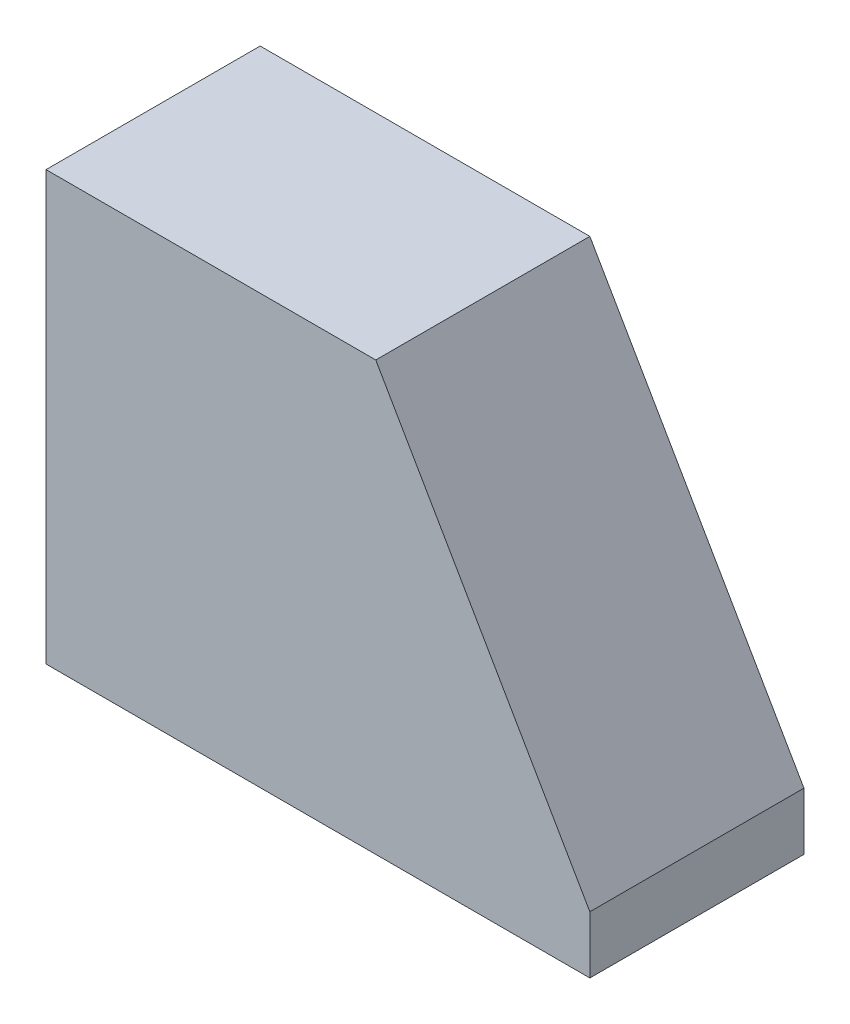
ISO-10303-21;
HEADER;
FILE_DESCRIPTION(('STEP AP214'),'2;1');
FILE_NAME('part.step','',(''),(''),'','','');
FILE_SCHEMA(('AUTOMOTIVE_DESIGN { 1 0 10303 214 1 1 1 1 }'));
ENDSEC;
DATA;
#1=APPLICATION_CONTEXT('core data for automotive mechanical design processes');
#2=APPLICATION_PROTOCOL_DEFINITION('international standard','automotive_design',2000,#1);
#3=PRODUCT_CONTEXT('',#1,'mechanical');
#4=PRODUCT('Part','Part','',(#3));
#5=PRODUCT_RELATED_PRODUCT_CATEGORY('part','',(#4));
#6=PRODUCT_DEFINITION_FORMATION('','',#4);
#7=PRODUCT_DEFINITION_CONTEXT('part definition',#1,'design');
#8=PRODUCT_DEFINITION('design','',#6,#7);
#9=PRODUCT_DEFINITION_SHAPE('','',#8);
#10=(LENGTH_UNIT() NAMED_UNIT(*) SI_UNIT(.MILLI.,.METRE.));
#11=(NAMED_UNIT(*) PLANE_ANGLE_UNIT() SI_UNIT($,.RADIAN.));
#12=(NAMED_UNIT(*) SI_UNIT($,.STERADIAN.) SOLID_ANGLE_UNIT());
#13=UNCERTAINTY_MEASURE_WITH_UNIT(LENGTH_MEASURE(1.E-05),#10,'distance_accuracy_value','');
#14=(GEOMETRIC_REPRESENTATION_CONTEXT(3) GLOBAL_UNCERTAINTY_ASSIGNED_CONTEXT((#13)) GLOBAL_UNIT_ASSIGNED_CONTEXT((#10,
#11,#12)) REPRESENTATION_CONTEXT('',''));
#15=CARTESIAN_POINT('',(0.,0.,0.));
#16=DIRECTION('',(0.,0.,1.));
#17=DIRECTION('',(1.,0.,0.));
#18=AXIS2_PLACEMENT_3D('',#15,#16,#17);
#19=CARTESIAN_POINT('',(25.4,-10.,-5.));
#20=DIRECTION('',(0.,0.,1.));
#21=DIRECTION('',(1.,0.,0.));
#22=AXIS2_PLACEMENT_3D('',#19,#20,#21);
#23=PLANE('',#22);
#24=DIRECTION('',(-1.,0.,0.));
#25=VECTOR('',#24,1.);
#26=CARTESIAN_POINT('',(25.4,10.,-5.));
#27=LINE('',#26,#25);
#28=CARTESIAN_POINT('',(15.4,10.,-5.));
#29=VERTEX_POINT('',#28);
#30=CARTESIAN_POINT('',(0.,10.,-5.));
#31=VERTEX_POINT('',#30);
#32=EDGE_CURVE('E138',#29,#31,#27,.T.);
#33=ORIENTED_EDGE('',*,*,#32,.F.);
#34=DIRECTION('',(-0.500000000000001,0.866025403784438,0.));
#35=VECTOR('',#34,1.);
#36=CARTESIAN_POINT('',(25.4,-7.32050807568877,-5.));
#37=LINE('',#36,#35);
#38=CARTESIAN_POINT('',(25.4,-7.32050807568877,-5.));
#39=VERTEX_POINT('',#38);
#40=EDGE_CURVE('E11',#29,#39,#37,.F.);
#41=ORIENTED_EDGE('',*,*,#40,.T.);
#42=DIRECTION('',(0.,1.,0.));
#43=VECTOR('',#42,1.);
#44=CARTESIAN_POINT('',(25.4,-10.,-5.));
#45=LINE('',#44,#43);
#46=CARTESIAN_POINT('',(25.4,-10.,-5.));
#47=VERTEX_POINT('',#46);
#48=EDGE_CURVE('E101',#47,#39,#45,.T.);
#49=ORIENTED_EDGE('',*,*,#48,.F.);
#50=DIRECTION('',(-1.,0.,0.));
#51=VECTOR('',#50,1.);
#52=CARTESIAN_POINT('',(25.4,-10.,-5.));
#53=LINE('',#52,#51);
#54=CARTESIAN_POINT('',(0.,-10.,-5.));
#55=VERTEX_POINT('',#54);
#56=EDGE_CURVE('E112',#47,#55,#53,.T.);
#57=ORIENTED_EDGE('',*,*,#56,.T.);
#58=DIRECTION('',(0.,1.,0.));
#59=VECTOR('',#58,1.);
#60=CARTESIAN_POINT('',(0.,-10.,-5.));
#61=LINE('',#60,#59);
#62=EDGE_CURVE('E123',#55,#31,#61,.T.);
#63=ORIENTED_EDGE('',*,*,#62,.T.);
#64=EDGE_LOOP('',(#33,#41,#49,#57,#63));
#65=FACE_BOUND('',#64,.T.);
#66=ADVANCED_FACE('F45',(#65),#23,.F.);
#67=CARTESIAN_POINT('',(25.4,10.,5.));
#68=DIRECTION('',(0.,-1.,0.));
#69=DIRECTION('',(0.,0.,-1.));
#70=AXIS2_PLACEMENT_3D('',#67,#68,#69);
#71=PLANE('',#70);
#72=DIRECTION('',(-1.,0.,0.));
#73=VECTOR('',#72,1.);
#74=CARTESIAN_POINT('',(25.4,10.,5.));
#75=LINE('',#74,#73);
#76=CARTESIAN_POINT('',(15.4,10.,5.));
#77=VERTEX_POINT('',#76);
#78=CARTESIAN_POINT('',(0.,10.,5.));
#79=VERTEX_POINT('',#78);
#80=EDGE_CURVE('E111',#77,#79,#75,.T.);
#81=ORIENTED_EDGE('',*,*,#80,.F.);
#82=DIRECTION('',(0.,0.,-1.));
#83=VECTOR('',#82,1.);
#84=CARTESIAN_POINT('',(15.4,10.,5.));
#85=LINE('',#84,#83);
#86=EDGE_CURVE('E55',#77,#29,#85,.T.);
#87=ORIENTED_EDGE('',*,*,#86,.T.);
#88=ORIENTED_EDGE('',*,*,#32,.T.);
#89=DIRECTION('',(0.,0.,1.));
#90=VECTOR('',#89,1.);
#91=CARTESIAN_POINT('',(0.,10.,5.));
#92=LINE('',#91,#90);
#93=EDGE_CURVE('E127',#31,#79,#92,.T.);
#94=ORIENTED_EDGE('',*,*,#93,.T.);
#95=EDGE_LOOP('',(#81,#87,#88,#94));
#96=FACE_BOUND('',#95,.T.);
#97=ADVANCED_FACE('F146',(#96),#71,.F.);
#98=CARTESIAN_POINT('',(25.4,-10.,5.));
#99=DIRECTION('',(0.,0.,-1.));
#100=DIRECTION('',(-1.,0.,0.));
#101=AXIS2_PLACEMENT_3D('',#98,#99,#100);
#102=PLANE('',#101);
#103=DIRECTION('',(0.,-1.,0.));
#104=VECTOR('',#103,1.);
#105=CARTESIAN_POINT('',(25.4,-10.,5.));
#106=LINE('',#105,#104);
#107=CARTESIAN_POINT('',(25.4,-7.32050807568877,5.));
#108=VERTEX_POINT('',#107);
#109=CARTESIAN_POINT('',(25.4,-10.,5.));
#110=VERTEX_POINT('',#109);
#111=EDGE_CURVE('E91',#108,#110,#106,.T.);
#112=ORIENTED_EDGE('',*,*,#111,.F.);
#113=DIRECTION('',(0.500000000000001,-0.866025403784438,0.));
#114=VECTOR('',#113,1.);
#115=CARTESIAN_POINT('',(25.4,-7.32050807568877,5.));
#116=LINE('',#115,#114);
#117=EDGE_CURVE('E69',#108,#77,#116,.F.);
#118=ORIENTED_EDGE('',*,*,#117,.T.);
#119=ORIENTED_EDGE('',*,*,#80,.T.);
#120=DIRECTION('',(0.,-1.,0.));
#121=VECTOR('',#120,1.);
#122=CARTESIAN_POINT('',(0.,-10.,5.));
#123=LINE('',#122,#121);
#124=CARTESIAN_POINT('',(0.,-10.,5.));
#125=VERTEX_POINT('',#124);
#126=EDGE_CURVE('E107',#79,#125,#123,.T.);
#127=ORIENTED_EDGE('',*,*,#126,.T.);
#128=DIRECTION('',(-1.,0.,0.));
#129=VECTOR('',#128,1.);
#130=CARTESIAN_POINT('',(25.4,-10.,5.));
#131=LINE('',#130,#129);
#132=EDGE_CURVE('E104',#110,#125,#131,.T.);
#133=ORIENTED_EDGE('',*,*,#132,.F.);
#134=EDGE_LOOP('',(#112,#118,#119,#127,#133));
#135=FACE_BOUND('',#134,.T.);
#136=ADVANCED_FACE('F105',(#135),#102,.F.);
#137=CARTESIAN_POINT('',(25.4,-10.,5.));
#138=DIRECTION('',(0.,1.,0.));
#139=DIRECTION('',(0.,0.,1.));
#140=AXIS2_PLACEMENT_3D('',#137,#138,#139);
#141=PLANE('',#140);
#142=DIRECTION('',(0.,0.,-1.));
#143=VECTOR('',#142,1.);
#144=CARTESIAN_POINT('',(0.,-10.,5.));
#145=LINE('',#144,#143);
#146=EDGE_CURVE('E133',#125,#55,#145,.T.);
#147=ORIENTED_EDGE('',*,*,#146,.T.);
#148=ORIENTED_EDGE('',*,*,#56,.F.);
#149=DIRECTION('',(0.,0.,-1.));
#150=VECTOR('',#149,1.);
#151=CARTESIAN_POINT('',(25.4,-10.,5.));
#152=LINE('',#151,#150);
#153=EDGE_CURVE('E96',#110,#47,#152,.T.);
#154=ORIENTED_EDGE('',*,*,#153,.F.);
#155=ORIENTED_EDGE('',*,*,#132,.T.);
#156=EDGE_LOOP('',(#147,#148,#154,#155));
#157=FACE_BOUND('',#156,.T.);
#158=ADVANCED_FACE('F114',(#157),#141,.F.);
#159=CARTESIAN_POINT('',(25.4,0.,0.));
#160=DIRECTION('',(-1.,0.,0.));
#161=DIRECTION('',(0.,0.,1.));
#162=AXIS2_PLACEMENT_3D('',#159,#160,#161);
#163=PLANE('',#162);
#164=ORIENTED_EDGE('',*,*,#48,.T.);
#165=DIRECTION('',(0.,0.,1.));
#166=VECTOR('',#165,1.);
#167=CARTESIAN_POINT('',(25.4,-7.32050807568877,0.));
#168=LINE('',#167,#166);
#169=EDGE_CURVE('E99',#39,#108,#168,.T.);
#170=ORIENTED_EDGE('',*,*,#169,.T.);
#171=ORIENTED_EDGE('',*,*,#111,.T.);
#172=ORIENTED_EDGE('',*,*,#153,.T.);
#173=EDGE_LOOP('',(#164,#170,#171,#172));
#174=FACE_BOUND('',#173,.T.);
#175=ADVANCED_FACE('F94',(#174),#163,.F.);
#176=CARTESIAN_POINT('',(0.,0.,0.));
#177=DIRECTION('',(-1.,0.,0.));
#178=DIRECTION('',(0.,0.,1.));
#179=AXIS2_PLACEMENT_3D('',#176,#177,#178);
#180=PLANE('',#179);
#181=ORIENTED_EDGE('',*,*,#62,.F.);
#182=ORIENTED_EDGE('',*,*,#146,.F.);
#183=ORIENTED_EDGE('',*,*,#126,.F.);
#184=ORIENTED_EDGE('',*,*,#93,.F.);
#185=EDGE_LOOP('',(#181,#182,#183,#184));
#186=FACE_BOUND('',#185,.T.);
#187=ADVANCED_FACE('F151',(#186),#180,.T.);
#188=CARTESIAN_POINT('',(25.4,-7.32050807568877,0.));
#189=DIRECTION('',(-0.866025403784438,-0.500000000000001,0.));
#190=DIRECTION('',(0.,0.,1.));
#191=AXIS2_PLACEMENT_3D('',#188,#189,#190);
#192=PLANE('',#191);
#193=ORIENTED_EDGE('',*,*,#40,.F.);
#194=ORIENTED_EDGE('',*,*,#86,.F.);
#195=ORIENTED_EDGE('',*,*,#117,.F.);
#196=ORIENTED_EDGE('',*,*,#169,.F.);
#197=EDGE_LOOP('',(#193,#194,#195,#196));
#198=FACE_BOUND('',#197,.T.);
#199=ADVANCED_FACE('F48',(#198),#192,.F.);
#200=CLOSED_SHELL('',(#66,#97,#136,#158,#175,#187,#199));
#201=MANIFOLD_SOLID_BREP('B2',#200);
#202=ADVANCED_BREP_SHAPE_REPRESENTATION('',(#18,#201),#14);
#203=SHAPE_DEFINITION_REPRESENTATION(#9,#202);
ENDSEC;
END-ISO-10303-21;
